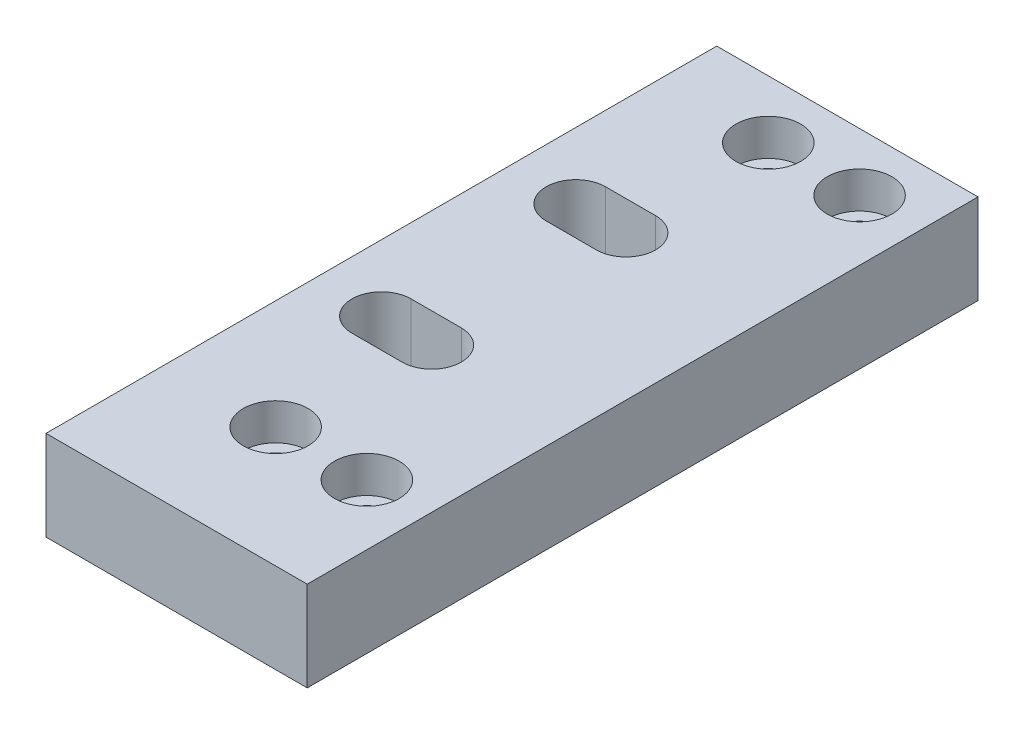
ISO-10303-21;
HEADER;
FILE_DESCRIPTION(('STEP AP214'),'2;1');
FILE_NAME('part.step','',(''),(''),'','','');
FILE_SCHEMA(('AUTOMOTIVE_DESIGN { 1 0 10303 214 1 1 1 1 }'));
ENDSEC;
DATA;
#1=APPLICATION_CONTEXT('core data for automotive mechanical design processes');
#2=APPLICATION_PROTOCOL_DEFINITION('international standard','automotive_design',2000,#1);
#3=PRODUCT_CONTEXT('',#1,'mechanical');
#4=PRODUCT('Part','Part','',(#3));
#5=PRODUCT_RELATED_PRODUCT_CATEGORY('part','',(#4));
#6=PRODUCT_DEFINITION_FORMATION('','',#4);
#7=PRODUCT_DEFINITION_CONTEXT('part definition',#1,'design');
#8=PRODUCT_DEFINITION('design','',#6,#7);
#9=PRODUCT_DEFINITION_SHAPE('','',#8);
#10=(LENGTH_UNIT() NAMED_UNIT(*) SI_UNIT(.MILLI.,.METRE.));
#11=(NAMED_UNIT(*) PLANE_ANGLE_UNIT() SI_UNIT($,.RADIAN.));
#12=(NAMED_UNIT(*) SI_UNIT($,.STERADIAN.) SOLID_ANGLE_UNIT());
#13=UNCERTAINTY_MEASURE_WITH_UNIT(LENGTH_MEASURE(1.E-05),#10,'distance_accuracy_value','');
#14=(GEOMETRIC_REPRESENTATION_CONTEXT(3) GLOBAL_UNCERTAINTY_ASSIGNED_CONTEXT((#13)) GLOBAL_UNIT_ASSIGNED_CONTEXT((#10,
#11,#12)) REPRESENTATION_CONTEXT('',''));
#15=CARTESIAN_POINT('',(0.,0.,0.));
#16=DIRECTION('',(0.,0.,1.));
#17=DIRECTION('',(1.,0.,0.));
#18=AXIS2_PLACEMENT_3D('',#15,#16,#17);
#19=CARTESIAN_POINT('',(172.730439972507,-18.55,-25.0827935222673));
#20=DIRECTION('',(0.,0.,-1.));
#21=DIRECTION('',(-1.,0.,0.));
#22=AXIS2_PLACEMENT_3D('',#19,#20,#21);
#23=PLANE('',#22);
#24=DIRECTION('',(-1.,0.,0.));
#25=VECTOR('',#24,1.);
#26=CARTESIAN_POINT('',(172.730439972507,-12.7,-25.0827935222673));
#27=LINE('',#26,#25);
#28=CARTESIAN_POINT('',(86.1333778809901,-12.7,-25.0827935222672));
#29=VERTEX_POINT('',#28);
#30=CARTESIAN_POINT('',(57.4997651451943,-12.7,-25.0827935222672));
#31=VERTEX_POINT('',#30);
#32=EDGE_CURVE('E291',#29,#31,#27,.T.);
#33=ORIENTED_EDGE('',*,*,#32,.F.);
#34=DIRECTION('',(0.,1.,0.));
#35=VECTOR('',#34,1.);
#36=CARTESIAN_POINT('',(86.1333778809901,-12.7,-25.0827935222672));
#37=LINE('',#36,#35);
#38=CARTESIAN_POINT('',(86.1333778809901,-22.55,-25.0827935222672));
#39=VERTEX_POINT('',#38);
#40=EDGE_CURVE('E278',#39,#29,#37,.T.);
#41=ORIENTED_EDGE('',*,*,#40,.F.);
#42=DIRECTION('',(1.,0.,0.));
#43=VECTOR('',#42,1.);
#44=CARTESIAN_POINT('',(57.4997651451943,-22.55,-25.0827935222672));
#45=LINE('',#44,#43);
#46=CARTESIAN_POINT('',(57.4997651451943,-22.55,-25.0827935222672));
#47=VERTEX_POINT('',#46);
#48=EDGE_CURVE('E289',#47,#39,#45,.T.);
#49=ORIENTED_EDGE('',*,*,#48,.F.);
#50=DIRECTION('',(0.,1.,0.));
#51=VECTOR('',#50,1.);
#52=CARTESIAN_POINT('',(57.4997651451943,-18.55,-25.0827935222672));
#53=LINE('',#52,#51);
#54=EDGE_CURVE('E195',#47,#31,#53,.T.);
#55=ORIENTED_EDGE('',*,*,#54,.T.);
#56=EDGE_LOOP('',(#33,#41,#49,#55));
#57=FACE_BOUND('',#56,.T.);
#58=ADVANCED_FACE('F185',(#57),#23,.T.);
#59=CARTESIAN_POINT('',(172.730439972507,-18.55,48.4420478508985));
#60=DIRECTION('',(0.,0.,-1.));
#61=DIRECTION('',(-1.,0.,0.));
#62=AXIS2_PLACEMENT_3D('',#59,#60,#61);
#63=PLANE('',#62);
#64=DIRECTION('',(0.,-1.,0.));
#65=VECTOR('',#64,1.);
#66=CARTESIAN_POINT('',(86.1333778809901,-12.7,48.4420478508985));
#67=LINE('',#66,#65);
#68=CARTESIAN_POINT('',(86.1333778809901,-12.7,48.4420478508985));
#69=VERTEX_POINT('',#68);
#70=CARTESIAN_POINT('',(86.1333778809901,-22.55,48.4420478508985));
#71=VERTEX_POINT('',#70);
#72=EDGE_CURVE('E203',#69,#71,#67,.T.);
#73=ORIENTED_EDGE('',*,*,#72,.F.);
#74=DIRECTION('',(-1.,0.,0.));
#75=VECTOR('',#74,1.);
#76=CARTESIAN_POINT('',(172.730439972507,-12.7,48.4420478508985));
#77=LINE('',#76,#75);
#78=CARTESIAN_POINT('',(57.4997651451944,-12.7,48.4420478508985));
#79=VERTEX_POINT('',#78);
#80=EDGE_CURVE('E210',#69,#79,#77,.T.);
#81=ORIENTED_EDGE('',*,*,#80,.T.);
#82=DIRECTION('',(0.,1.,0.));
#83=VECTOR('',#82,1.);
#84=CARTESIAN_POINT('',(57.4997651451944,-18.55,48.4420478508985));
#85=LINE('',#84,#83);
#86=CARTESIAN_POINT('',(57.4997651451944,-22.55,48.4420478508985));
#87=VERTEX_POINT('',#86);
#88=EDGE_CURVE('E12',#87,#79,#85,.T.);
#89=ORIENTED_EDGE('',*,*,#88,.F.);
#90=DIRECTION('',(-1.,0.,0.));
#91=VECTOR('',#90,1.);
#92=CARTESIAN_POINT('',(91.1333778809901,-22.55,48.4420478508985));
#93=LINE('',#92,#91);
#94=EDGE_CURVE('E299',#71,#87,#93,.T.);
#95=ORIENTED_EDGE('',*,*,#94,.F.);
#96=EDGE_LOOP('',(#73,#81,#89,#95));
#97=FACE_BOUND('',#96,.T.);
#98=ADVANCED_FACE('F469',(#97),#63,.F.);
#99=CARTESIAN_POINT('',(172.730439972507,-12.7,0.));
#100=DIRECTION('',(0.,1.,0.));
#101=DIRECTION('',(0.,0.,1.));
#102=AXIS2_PLACEMENT_3D('',#99,#100,#101);
#103=PLANE('',#102);
#104=CARTESIAN_POINT('',(69.4985978672434,-12.7,35.2672064777328));
#105=DIRECTION('',(0.,1.,0.));
#106=DIRECTION('',(0.,0.,1.));
#107=AXIS2_PLACEMENT_3D('',#104,#105,#106);
#108=CIRCLE('',#107,3.55);
#109=CARTESIAN_POINT('',(69.4985978672434,-12.7,38.8172064777328));
#110=VERTEX_POINT('',#109);
#111=EDGE_CURVE('E335',#110,#110,#108,.T.);
#112=ORIENTED_EDGE('',*,*,#111,.F.);
#113=EDGE_LOOP('',(#112));
#114=FACE_BOUND('',#113,.T.);
#115=CARTESIAN_POINT('',(79.4985978672434,-12.7,-18.7327935222672));
#116=DIRECTION('',(0.,1.,0.));
#117=DIRECTION('',(0.,0.,1.));
#118=AXIS2_PLACEMENT_3D('',#115,#116,#117);
#119=CIRCLE('',#118,3.55);
#120=CARTESIAN_POINT('',(79.4985978672434,-12.7,-15.1827935222672));
#121=VERTEX_POINT('',#120);
#122=EDGE_CURVE('E323',#121,#121,#119,.T.);
#123=ORIENTED_EDGE('',*,*,#122,.F.);
#124=EDGE_LOOP('',(#123));
#125=FACE_BOUND('',#124,.T.);
#126=CARTESIAN_POINT('',(69.4985978672434,-12.7,-18.7327935222672));
#127=DIRECTION('',(0.,1.,0.));
#128=DIRECTION('',(0.,0.,1.));
#129=AXIS2_PLACEMENT_3D('',#126,#127,#128);
#130=CIRCLE('',#129,3.55);
#131=CARTESIAN_POINT('',(69.4985978672434,-12.7,-15.1827935222672));
#132=VERTEX_POINT('',#131);
#133=EDGE_CURVE('E309',#132,#132,#130,.T.);
#134=ORIENTED_EDGE('',*,*,#133,.F.);
#135=EDGE_LOOP('',(#134));
#136=FACE_BOUND('',#135,.T.);
#137=CARTESIAN_POINT('',(79.4985978672434,-12.7,35.2672064777328));
#138=DIRECTION('',(0.,1.,0.));
#139=DIRECTION('',(0.,0.,1.));
#140=AXIS2_PLACEMENT_3D('',#137,#138,#139);
#141=CIRCLE('',#140,3.55);
#142=CARTESIAN_POINT('',(79.4985978672434,-12.7,38.8172064777328));
#143=VERTEX_POINT('',#142);
#144=EDGE_CURVE('E348',#143,#143,#141,.T.);
#145=ORIENTED_EDGE('',*,*,#144,.F.);
#146=EDGE_LOOP('',(#145));
#147=FACE_BOUND('',#146,.T.);
#148=DIRECTION('',(1.,0.,0.));
#149=VECTOR('',#148,1.);
#150=CARTESIAN_POINT('',(172.730439972507,-12.7,0.867206477732725));
#151=LINE('',#150,#149);
#152=CARTESIAN_POINT('',(64.7497651451943,-12.7,0.867206477732787));
#153=VERTEX_POINT('',#152);
#154=CARTESIAN_POINT('',(70.2497651451943,-12.7,0.867206477732783));
#155=VERTEX_POINT('',#154);
#156=EDGE_CURVE('E353',#153,#155,#151,.T.);
#157=ORIENTED_EDGE('',*,*,#156,.F.);
#158=CARTESIAN_POINT('',(64.7497651451943,-12.7,-2.38279352226721));
#159=DIRECTION('',(0.,1.,0.));
#160=DIRECTION('',(0.,0.,1.));
#161=AXIS2_PLACEMENT_3D('',#158,#159,#160);
#162=CIRCLE('',#161,3.25);
#163=CARTESIAN_POINT('',(64.7497651451943,-12.7,-5.63279352226722));
#164=VERTEX_POINT('',#163);
#165=EDGE_CURVE('E360',#164,#153,#162,.T.);
#166=ORIENTED_EDGE('',*,*,#165,.F.);
#167=DIRECTION('',(1.,0.,0.));
#168=VECTOR('',#167,1.);
#169=CARTESIAN_POINT('',(172.730439972507,-12.7,-5.63279352226728));
#170=LINE('',#169,#168);
#171=CARTESIAN_POINT('',(70.2497651451943,-12.7,-5.63279352226722));
#172=VERTEX_POINT('',#171);
#173=EDGE_CURVE('E363',#164,#172,#170,.T.);
#174=ORIENTED_EDGE('',*,*,#173,.T.);
#175=CARTESIAN_POINT('',(70.2497651451943,-12.7,-2.38279352226722));
#176=DIRECTION('',(0.,1.,0.));
#177=DIRECTION('',(0.,0.,1.));
#178=AXIS2_PLACEMENT_3D('',#175,#176,#177);
#179=CIRCLE('',#178,3.25);
#180=EDGE_CURVE('E366',#155,#172,#179,.T.);
#181=ORIENTED_EDGE('',*,*,#180,.F.);
#182=EDGE_LOOP('',(#157,#166,#174,#181));
#183=FACE_BOUND('',#182,.T.);
#184=DIRECTION('',(1.,0.,0.));
#185=VECTOR('',#184,1.);
#186=CARTESIAN_POINT('',(172.730439972507,-12.7,22.1672064777327));
#187=LINE('',#186,#185);
#188=CARTESIAN_POINT('',(64.7497651451943,-12.7,22.1672064777328));
#189=VERTEX_POINT('',#188);
#190=CARTESIAN_POINT('',(70.2497651451943,-12.7,22.1672064777328));
#191=VERTEX_POINT('',#190);
#192=EDGE_CURVE('E370',#189,#191,#187,.T.);
#193=ORIENTED_EDGE('',*,*,#192,.F.);
#194=CARTESIAN_POINT('',(64.7497651451943,-12.7,18.9172064777328));
#195=DIRECTION('',(0.,1.,0.));
#196=DIRECTION('',(0.,0.,1.));
#197=AXIS2_PLACEMENT_3D('',#194,#195,#196);
#198=CIRCLE('',#197,3.25);
#199=CARTESIAN_POINT('',(64.7497651451943,-12.7,15.6672064777328));
#200=VERTEX_POINT('',#199);
#201=EDGE_CURVE('E374',#200,#189,#198,.T.);
#202=ORIENTED_EDGE('',*,*,#201,.F.);
#203=DIRECTION('',(1.,0.,0.));
#204=VECTOR('',#203,1.);
#205=CARTESIAN_POINT('',(172.730439972507,-12.7,15.6672064777327));
#206=LINE('',#205,#204);
#207=CARTESIAN_POINT('',(70.2497651451943,-12.7,15.6672064777328));
#208=VERTEX_POINT('',#207);
#209=EDGE_CURVE('E377',#200,#208,#206,.T.);
#210=ORIENTED_EDGE('',*,*,#209,.T.);
#211=CARTESIAN_POINT('',(70.2497651451943,-12.7,18.9172064777328));
#212=DIRECTION('',(0.,1.,0.));
#213=DIRECTION('',(0.,0.,1.));
#214=AXIS2_PLACEMENT_3D('',#211,#212,#213);
#215=CIRCLE('',#214,3.25);
#216=EDGE_CURVE('E380',#191,#208,#215,.T.);
#217=ORIENTED_EDGE('',*,*,#216,.F.);
#218=EDGE_LOOP('',(#193,#202,#210,#217));
#219=FACE_BOUND('',#218,.T.);
#220=ORIENTED_EDGE('',*,*,#80,.F.);
#221=DIRECTION('',(0.,0.,1.));
#222=VECTOR('',#221,1.);
#223=CARTESIAN_POINT('',(86.1333778809901,-12.7,48.4420478508985));
#224=LINE('',#223,#222);
#225=EDGE_CURVE('E293',#29,#69,#224,.T.);
#226=ORIENTED_EDGE('',*,*,#225,.F.);
#227=ORIENTED_EDGE('',*,*,#32,.T.);
#228=DIRECTION('',(0.,0.,1.));
#229=VECTOR('',#228,1.);
#230=CARTESIAN_POINT('',(57.4997651451943,-12.7,0.));
#231=LINE('',#230,#229);
#232=EDGE_CURVE('E386',#31,#79,#231,.T.);
#233=ORIENTED_EDGE('',*,*,#232,.T.);
#234=EDGE_LOOP('',(#220,#226,#227,#233));
#235=FACE_BOUND('',#234,.T.);
#236=ADVANCED_FACE('F431',(#114,#125,#136,#147,#183,#219,#235),#103,.T.);
#237=CARTESIAN_POINT('',(0.,-22.55,0.));
#238=DIRECTION('',(0.,-1.,0.));
#239=DIRECTION('',(0.,0.,-1.));
#240=AXIS2_PLACEMENT_3D('',#237,#238,#239);
#241=PLANE('',#240);
#242=CARTESIAN_POINT('',(79.4985978672434,-22.55,35.2672064777328));
#243=DIRECTION('',(0.,-1.,0.));
#244=DIRECTION('',(0.,0.,-1.));
#245=AXIS2_PLACEMENT_3D('',#242,#243,#244);
#246=CIRCLE('',#245,2.2);
#247=CARTESIAN_POINT('',(79.4985978672434,-22.55,33.0672064777328));
#248=VERTEX_POINT('',#247);
#249=EDGE_CURVE('E801',#248,#248,#246,.T.);
#250=ORIENTED_EDGE('',*,*,#249,.F.);
#251=EDGE_LOOP('',(#250));
#252=FACE_BOUND('',#251,.T.);
#253=CARTESIAN_POINT('',(79.4985978672434,-22.55,-18.7327935222672));
#254=DIRECTION('',(0.,-1.,0.));
#255=DIRECTION('',(0.,0.,-1.));
#256=AXIS2_PLACEMENT_3D('',#253,#254,#255);
#257=CIRCLE('',#256,2.2);
#258=CARTESIAN_POINT('',(79.4985978672434,-22.55,-20.9327935222672));
#259=VERTEX_POINT('',#258);
#260=EDGE_CURVE('E442',#259,#259,#257,.T.);
#261=ORIENTED_EDGE('',*,*,#260,.F.);
#262=EDGE_LOOP('',(#261));
#263=FACE_BOUND('',#262,.T.);
#264=DIRECTION('',(-1.,0.,0.));
#265=VECTOR('',#264,1.);
#266=CARTESIAN_POINT('',(64.7497651451943,-22.55,0.867206477732787));
#267=LINE('',#266,#265);
#268=CARTESIAN_POINT('',(70.2497651451943,-22.55,0.867206477732783));
#269=VERTEX_POINT('',#268);
#270=CARTESIAN_POINT('',(64.7497651451943,-22.55,0.867206477732788));
#271=VERTEX_POINT('',#270);
#272=EDGE_CURVE('E428',#269,#271,#267,.T.);
#273=ORIENTED_EDGE('',*,*,#272,.F.);
#274=CARTESIAN_POINT('',(70.2497651451943,-22.55,-2.38279352226722));
#275=DIRECTION('',(0.,-1.,0.));
#276=DIRECTION('',(0.,0.,-1.));
#277=AXIS2_PLACEMENT_3D('',#274,#275,#276);
#278=CIRCLE('',#277,3.25);
#279=CARTESIAN_POINT('',(70.2497651451943,-22.55,-5.63279352226722));
#280=VERTEX_POINT('',#279);
#281=EDGE_CURVE('E437',#280,#269,#278,.T.);
#282=ORIENTED_EDGE('',*,*,#281,.F.);
#283=DIRECTION('',(1.,0.,0.));
#284=VECTOR('',#283,1.);
#285=CARTESIAN_POINT('',(64.7497651451943,-22.55,-5.63279352226722));
#286=LINE('',#285,#284);
#287=CARTESIAN_POINT('',(64.7497651451943,-22.55,-5.63279352226722));
#288=VERTEX_POINT('',#287);
#289=EDGE_CURVE('E305',#288,#280,#286,.T.);
#290=ORIENTED_EDGE('',*,*,#289,.F.);
#291=CARTESIAN_POINT('',(64.7497651451943,-22.55,-2.38279352226721));
#292=DIRECTION('',(0.,-1.,0.));
#293=DIRECTION('',(0.,0.,-1.));
#294=AXIS2_PLACEMENT_3D('',#291,#292,#293);
#295=CIRCLE('',#294,3.25);
#296=EDGE_CURVE('E445',#271,#288,#295,.T.);
#297=ORIENTED_EDGE('',*,*,#296,.F.);
#298=EDGE_LOOP('',(#273,#282,#290,#297));
#299=FACE_BOUND('',#298,.T.);
#300=CARTESIAN_POINT('',(69.4985978672434,-22.55,-18.7327935222672));
#301=DIRECTION('',(0.,-1.,0.));
#302=DIRECTION('',(0.,0.,-1.));
#303=AXIS2_PLACEMENT_3D('',#300,#301,#302);
#304=CIRCLE('',#303,2.2);
#305=CARTESIAN_POINT('',(69.4985978672434,-22.55,-20.9327935222672));
#306=VERTEX_POINT('',#305);
#307=EDGE_CURVE('E803',#306,#306,#304,.T.);
#308=ORIENTED_EDGE('',*,*,#307,.F.);
#309=EDGE_LOOP('',(#308));
#310=FACE_BOUND('',#309,.T.);
#311=CARTESIAN_POINT('',(69.4985978672434,-22.55,35.2672064777328));
#312=DIRECTION('',(0.,-1.,0.));
#313=DIRECTION('',(0.,0.,-1.));
#314=AXIS2_PLACEMENT_3D('',#311,#312,#313);
#315=CIRCLE('',#314,2.2);
#316=CARTESIAN_POINT('',(69.4985978672434,-22.55,33.0672064777328));
#317=VERTEX_POINT('',#316);
#318=EDGE_CURVE('E804',#317,#317,#315,.T.);
#319=ORIENTED_EDGE('',*,*,#318,.F.);
#320=EDGE_LOOP('',(#319));
#321=FACE_BOUND('',#320,.T.);
#322=DIRECTION('',(1.,0.,0.));
#323=VECTOR('',#322,1.);
#324=CARTESIAN_POINT('',(64.7497651451943,-22.55,15.6672064777328));
#325=LINE('',#324,#323);
#326=CARTESIAN_POINT('',(64.7497651451943,-22.55,15.6672064777328));
#327=VERTEX_POINT('',#326);
#328=CARTESIAN_POINT('',(70.2497651451943,-22.55,15.6672064777328));
#329=VERTEX_POINT('',#328);
#330=EDGE_CURVE('E826',#327,#329,#325,.T.);
#331=ORIENTED_EDGE('',*,*,#330,.F.);
#332=CARTESIAN_POINT('',(64.7497651451943,-22.55,18.9172064777328));
#333=DIRECTION('',(0.,-1.,0.));
#334=DIRECTION('',(0.,0.,-1.));
#335=AXIS2_PLACEMENT_3D('',#332,#333,#334);
#336=CIRCLE('',#335,3.25);
#337=CARTESIAN_POINT('',(64.7497651451943,-22.55,22.1672064777328));
#338=VERTEX_POINT('',#337);
#339=EDGE_CURVE('E830',#338,#327,#336,.T.);
#340=ORIENTED_EDGE('',*,*,#339,.F.);
#341=DIRECTION('',(-1.,0.,0.));
#342=VECTOR('',#341,1.);
#343=CARTESIAN_POINT('',(64.7497651451943,-22.55,22.1672064777328));
#344=LINE('',#343,#342);
#345=CARTESIAN_POINT('',(70.2497651451943,-22.55,22.1672064777328));
#346=VERTEX_POINT('',#345);
#347=EDGE_CURVE('E811',#346,#338,#344,.T.);
#348=ORIENTED_EDGE('',*,*,#347,.F.);
#349=CARTESIAN_POINT('',(70.2497651451943,-22.55,18.9172064777328));
#350=DIRECTION('',(0.,-1.,0.));
#351=DIRECTION('',(0.,0.,-1.));
#352=AXIS2_PLACEMENT_3D('',#349,#350,#351);
#353=CIRCLE('',#352,3.25);
#354=EDGE_CURVE('E822',#329,#346,#353,.T.);
#355=ORIENTED_EDGE('',*,*,#354,.F.);
#356=EDGE_LOOP('',(#331,#340,#348,#355));
#357=FACE_BOUND('',#356,.T.);
#358=ORIENTED_EDGE('',*,*,#48,.T.);
#359=DIRECTION('',(0.,0.,-1.));
#360=VECTOR('',#359,1.);
#361=CARTESIAN_POINT('',(86.1333778809901,-22.55,48.4420478508985));
#362=LINE('',#361,#360);
#363=EDGE_CURVE('E275',#71,#39,#362,.T.);
#364=ORIENTED_EDGE('',*,*,#363,.F.);
#365=ORIENTED_EDGE('',*,*,#94,.T.);
#366=DIRECTION('',(0.,0.,-1.));
#367=VECTOR('',#366,1.);
#368=CARTESIAN_POINT('',(57.4997651451944,-22.55,48.4420478508985));
#369=LINE('',#368,#367);
#370=EDGE_CURVE('E297',#87,#47,#369,.T.);
#371=ORIENTED_EDGE('',*,*,#370,.T.);
#372=EDGE_LOOP('',(#358,#364,#365,#371));
#373=FACE_BOUND('',#372,.T.);
#374=ADVANCED_FACE('F295',(#252,#263,#299,#310,#321,#357,#373),#241,.T.);
#375=CARTESIAN_POINT('',(69.4985978672434,-18.55,-18.7327935222672));
#376=DIRECTION('',(0.,1.,0.));
#377=DIRECTION('',(0.,0.,1.));
#378=AXIS2_PLACEMENT_3D('',#375,#376,#377);
#379=CYLINDRICAL_SURFACE('',#378,2.19999999999999);
#380=CARTESIAN_POINT('',(69.4985978672434,-16.7,-18.7327935222672));
#381=DIRECTION('',(0.,1.,0.));
#382=DIRECTION('',(0.,0.,1.));
#383=AXIS2_PLACEMENT_3D('',#380,#381,#382);
#384=CIRCLE('',#383,2.2);
#385=CARTESIAN_POINT('',(69.4985978672434,-16.7,-16.5327935222672));
#386=VERTEX_POINT('',#385);
#387=EDGE_CURVE('E313',#386,#386,#384,.T.);
#388=ORIENTED_EDGE('',*,*,#387,.T.);
#389=EDGE_LOOP('',(#388));
#390=FACE_BOUND('',#389,.T.);
#391=ORIENTED_EDGE('',*,*,#307,.T.);
#392=EDGE_LOOP('',(#391));
#393=FACE_BOUND('',#392,.T.);
#394=ADVANCED_FACE('F476',(#390,#393),#379,.F.);
#395=CARTESIAN_POINT('',(79.4985978672434,-18.55,-18.7327935222672));
#396=DIRECTION('',(0.,1.,0.));
#397=DIRECTION('',(0.,0.,1.));
#398=AXIS2_PLACEMENT_3D('',#395,#396,#397);
#399=CYLINDRICAL_SURFACE('',#398,2.19999999999999);
#400=CARTESIAN_POINT('',(79.4985978672434,-16.7,-18.7327935222672));
#401=DIRECTION('',(0.,1.,0.));
#402=DIRECTION('',(0.,0.,1.));
#403=AXIS2_PLACEMENT_3D('',#400,#401,#402);
#404=CIRCLE('',#403,2.2);
#405=CARTESIAN_POINT('',(79.4985978672434,-16.7,-16.5327935222672));
#406=VERTEX_POINT('',#405);
#407=EDGE_CURVE('E318',#406,#406,#404,.T.);
#408=ORIENTED_EDGE('',*,*,#407,.T.);
#409=EDGE_LOOP('',(#408));
#410=FACE_BOUND('',#409,.T.);
#411=ORIENTED_EDGE('',*,*,#260,.T.);
#412=EDGE_LOOP('',(#411));
#413=FACE_BOUND('',#412,.T.);
#414=ADVANCED_FACE('F479',(#410,#413),#399,.F.);
#415=CARTESIAN_POINT('',(79.4985978672434,-18.55,35.2672064777328));
#416=DIRECTION('',(0.,1.,0.));
#417=DIRECTION('',(0.,0.,1.));
#418=AXIS2_PLACEMENT_3D('',#415,#416,#417);
#419=CYLINDRICAL_SURFACE('',#418,2.19999999999999);
#420=CARTESIAN_POINT('',(79.4985978672434,-16.7,35.2672064777328));
#421=DIRECTION('',(0.,1.,0.));
#422=DIRECTION('',(0.,0.,1.));
#423=AXIS2_PLACEMENT_3D('',#420,#421,#422);
#424=CIRCLE('',#423,2.2);
#425=CARTESIAN_POINT('',(79.4985978672434,-16.7,37.4672064777328));
#426=VERTEX_POINT('',#425);
#427=EDGE_CURVE('E322',#426,#426,#424,.T.);
#428=ORIENTED_EDGE('',*,*,#427,.T.);
#429=EDGE_LOOP('',(#428));
#430=FACE_BOUND('',#429,.T.);
#431=ORIENTED_EDGE('',*,*,#249,.T.);
#432=EDGE_LOOP('',(#431));
#433=FACE_BOUND('',#432,.T.);
#434=ADVANCED_FACE('F483',(#430,#433),#419,.F.);
#435=CARTESIAN_POINT('',(69.4985978672434,-18.55,35.2672064777328));
#436=DIRECTION('',(0.,1.,0.));
#437=DIRECTION('',(0.,0.,1.));
#438=AXIS2_PLACEMENT_3D('',#435,#436,#437);
#439=CYLINDRICAL_SURFACE('',#438,2.19999999999999);
#440=CARTESIAN_POINT('',(69.4985978672434,-16.7,35.2672064777328));
#441=DIRECTION('',(0.,1.,0.));
#442=DIRECTION('',(0.,0.,1.));
#443=AXIS2_PLACEMENT_3D('',#440,#441,#442);
#444=CIRCLE('',#443,2.2);
#445=CARTESIAN_POINT('',(69.4985978672434,-16.7,37.4672064777328));
#446=VERTEX_POINT('',#445);
#447=EDGE_CURVE('E331',#446,#446,#444,.T.);
#448=ORIENTED_EDGE('',*,*,#447,.T.);
#449=EDGE_LOOP('',(#448));
#450=FACE_BOUND('',#449,.T.);
#451=ORIENTED_EDGE('',*,*,#318,.T.);
#452=EDGE_LOOP('',(#451));
#453=FACE_BOUND('',#452,.T.);
#454=ADVANCED_FACE('F487',(#450,#453),#439,.F.);
#455=CARTESIAN_POINT('',(172.730439972507,-18.55,22.1672064777327));
#456=DIRECTION('',(0.,0.,1.));
#457=DIRECTION('',(1.,0.,0.));
#458=AXIS2_PLACEMENT_3D('',#455,#456,#457);
#459=PLANE('',#458);
#460=ORIENTED_EDGE('',*,*,#192,.T.);
#461=DIRECTION('',(0.,1.,0.));
#462=VECTOR('',#461,1.);
#463=CARTESIAN_POINT('',(70.2497651451943,-18.55,22.1672064777328));
#464=LINE('',#463,#462);
#465=EDGE_CURVE('E393',#346,#191,#464,.T.);
#466=ORIENTED_EDGE('',*,*,#465,.F.);
#467=ORIENTED_EDGE('',*,*,#347,.T.);
#468=DIRECTION('',(0.,1.,0.));
#469=VECTOR('',#468,1.);
#470=CARTESIAN_POINT('',(64.7497651451943,-18.55,22.1672064777328));
#471=LINE('',#470,#469);
#472=EDGE_CURVE('E405',#338,#189,#471,.T.);
#473=ORIENTED_EDGE('',*,*,#472,.T.);
#474=EDGE_LOOP('',(#460,#466,#467,#473));
#475=FACE_BOUND('',#474,.T.);
#476=ADVANCED_FACE('F491',(#475),#459,.F.);
#477=CARTESIAN_POINT('',(70.2497651451943,-18.55,18.9172064777328));
#478=DIRECTION('',(0.,1.,0.));
#479=DIRECTION('',(0.,0.,1.));
#480=AXIS2_PLACEMENT_3D('',#477,#478,#479);
#481=CYLINDRICAL_SURFACE('',#480,3.25);
#482=ORIENTED_EDGE('',*,*,#216,.T.);
#483=DIRECTION('',(0.,1.,0.));
#484=VECTOR('',#483,1.);
#485=CARTESIAN_POINT('',(70.2497651451943,-18.55,15.6672064777328));
#486=LINE('',#485,#484);
#487=EDGE_CURVE('E397',#329,#208,#486,.T.);
#488=ORIENTED_EDGE('',*,*,#487,.F.);
#489=ORIENTED_EDGE('',*,*,#354,.T.);
#490=ORIENTED_EDGE('',*,*,#465,.T.);
#491=EDGE_LOOP('',(#482,#488,#489,#490));
#492=FACE_BOUND('',#491,.T.);
#493=ADVANCED_FACE('F493',(#492),#481,.F.);
#494=CARTESIAN_POINT('',(172.730439972507,-18.55,15.6672064777327));
#495=DIRECTION('',(0.,0.,1.));
#496=DIRECTION('',(1.,0.,0.));
#497=AXIS2_PLACEMENT_3D('',#494,#495,#496);
#498=PLANE('',#497);
#499=ORIENTED_EDGE('',*,*,#209,.F.);
#500=DIRECTION('',(0.,1.,0.));
#501=VECTOR('',#500,1.);
#502=CARTESIAN_POINT('',(64.7497651451943,-18.55,15.6672064777328));
#503=LINE('',#502,#501);
#504=EDGE_CURVE('E401',#327,#200,#503,.T.);
#505=ORIENTED_EDGE('',*,*,#504,.F.);
#506=ORIENTED_EDGE('',*,*,#330,.T.);
#507=ORIENTED_EDGE('',*,*,#487,.T.);
#508=EDGE_LOOP('',(#499,#505,#506,#507));
#509=FACE_BOUND('',#508,.T.);
#510=ADVANCED_FACE('F496',(#509),#498,.T.);
#511=CARTESIAN_POINT('',(172.730439972507,-18.55,0.867206477732725));
#512=DIRECTION('',(0.,0.,1.));
#513=DIRECTION('',(1.,0.,0.));
#514=AXIS2_PLACEMENT_3D('',#511,#512,#513);
#515=PLANE('',#514);
#516=ORIENTED_EDGE('',*,*,#156,.T.);
#517=DIRECTION('',(0.,1.,0.));
#518=VECTOR('',#517,1.);
#519=CARTESIAN_POINT('',(70.2497651451943,-18.55,0.867206477732783));
#520=LINE('',#519,#518);
#521=EDGE_CURVE('E409',#269,#155,#520,.T.);
#522=ORIENTED_EDGE('',*,*,#521,.F.);
#523=ORIENTED_EDGE('',*,*,#272,.T.);
#524=DIRECTION('',(0.,1.,0.));
#525=VECTOR('',#524,1.);
#526=CARTESIAN_POINT('',(64.7497651451943,-18.55,0.867206477732787));
#527=LINE('',#526,#525);
#528=EDGE_CURVE('E189',#271,#153,#527,.T.);
#529=ORIENTED_EDGE('',*,*,#528,.T.);
#530=EDGE_LOOP('',(#516,#522,#523,#529));
#531=FACE_BOUND('',#530,.T.);
#532=ADVANCED_FACE('F187',(#531),#515,.F.);
#533=CARTESIAN_POINT('',(70.2497651451943,-18.55,-2.38279352226722));
#534=DIRECTION('',(0.,1.,0.));
#535=DIRECTION('',(0.,0.,1.));
#536=AXIS2_PLACEMENT_3D('',#533,#534,#535);
#537=CYLINDRICAL_SURFACE('',#536,3.25);
#538=ORIENTED_EDGE('',*,*,#180,.T.);
#539=DIRECTION('',(0.,1.,0.));
#540=VECTOR('',#539,1.);
#541=CARTESIAN_POINT('',(70.2497651451943,-18.55,-5.63279352226722));
#542=LINE('',#541,#540);
#543=EDGE_CURVE('E413',#280,#172,#542,.T.);
#544=ORIENTED_EDGE('',*,*,#543,.F.);
#545=ORIENTED_EDGE('',*,*,#281,.T.);
#546=ORIENTED_EDGE('',*,*,#521,.T.);
#547=EDGE_LOOP('',(#538,#544,#545,#546));
#548=FACE_BOUND('',#547,.T.);
#549=ADVANCED_FACE('F435',(#548),#537,.F.);
#550=CARTESIAN_POINT('',(172.730439972507,-18.55,-5.63279352226728));
#551=DIRECTION('',(0.,0.,1.));
#552=DIRECTION('',(1.,0.,0.));
#553=AXIS2_PLACEMENT_3D('',#550,#551,#552);
#554=PLANE('',#553);
#555=ORIENTED_EDGE('',*,*,#173,.F.);
#556=DIRECTION('',(0.,1.,0.));
#557=VECTOR('',#556,1.);
#558=CARTESIAN_POINT('',(64.7497651451943,-18.55,-5.63279352226722));
#559=LINE('',#558,#557);
#560=EDGE_CURVE('E416',#288,#164,#559,.T.);
#561=ORIENTED_EDGE('',*,*,#560,.F.);
#562=ORIENTED_EDGE('',*,*,#289,.T.);
#563=ORIENTED_EDGE('',*,*,#543,.T.);
#564=EDGE_LOOP('',(#555,#561,#562,#563));
#565=FACE_BOUND('',#564,.T.);
#566=ADVANCED_FACE('F453',(#565),#554,.T.);
#567=CARTESIAN_POINT('',(64.7497651451943,-18.55,18.9172064777328));
#568=DIRECTION('',(0.,1.,0.));
#569=DIRECTION('',(0.,0.,1.));
#570=AXIS2_PLACEMENT_3D('',#567,#568,#569);
#571=CYLINDRICAL_SURFACE('',#570,3.25);
#572=ORIENTED_EDGE('',*,*,#201,.T.);
#573=ORIENTED_EDGE('',*,*,#472,.F.);
#574=ORIENTED_EDGE('',*,*,#339,.T.);
#575=ORIENTED_EDGE('',*,*,#504,.T.);
#576=EDGE_LOOP('',(#572,#573,#574,#575));
#577=FACE_BOUND('',#576,.T.);
#578=ADVANCED_FACE('F457',(#577),#571,.F.);
#579=CARTESIAN_POINT('',(64.7497651451943,-18.55,-2.38279352226721));
#580=DIRECTION('',(0.,1.,0.));
#581=DIRECTION('',(0.,0.,1.));
#582=AXIS2_PLACEMENT_3D('',#579,#580,#581);
#583=CYLINDRICAL_SURFACE('',#582,3.25);
#584=ORIENTED_EDGE('',*,*,#165,.T.);
#585=ORIENTED_EDGE('',*,*,#528,.F.);
#586=ORIENTED_EDGE('',*,*,#296,.T.);
#587=ORIENTED_EDGE('',*,*,#560,.T.);
#588=EDGE_LOOP('',(#584,#585,#586,#587));
#589=FACE_BOUND('',#588,.T.);
#590=ADVANCED_FACE('F454',(#589),#583,.F.);
#591=CARTESIAN_POINT('',(57.4997651451943,-18.55,0.));
#592=DIRECTION('',(-1.,0.,0.));
#593=DIRECTION('',(0.,0.,1.));
#594=AXIS2_PLACEMENT_3D('',#591,#592,#593);
#595=PLANE('',#594);
#596=ORIENTED_EDGE('',*,*,#232,.F.);
#597=ORIENTED_EDGE('',*,*,#54,.F.);
#598=ORIENTED_EDGE('',*,*,#370,.F.);
#599=ORIENTED_EDGE('',*,*,#88,.T.);
#600=EDGE_LOOP('',(#596,#597,#598,#599));
#601=FACE_BOUND('',#600,.T.);
#602=ADVANCED_FACE('F456',(#601),#595,.T.);
#603=CARTESIAN_POINT('',(79.4985978672434,-16.7,35.2672064777328));
#604=DIRECTION('',(0.,1.,0.));
#605=DIRECTION('',(0.,0.,1.));
#606=AXIS2_PLACEMENT_3D('',#603,#604,#605);
#607=CYLINDRICAL_SURFACE('',#606,3.55);
#608=CARTESIAN_POINT('',(79.4985978672434,-16.7,35.2672064777328));
#609=DIRECTION('',(0.,1.,0.));
#610=DIRECTION('',(0.,0.,1.));
#611=AXIS2_PLACEMENT_3D('',#608,#609,#610);
#612=CIRCLE('',#611,3.55);
#613=CARTESIAN_POINT('',(79.4985978672434,-16.7,38.8172064777328));
#614=VERTEX_POINT('',#613);
#615=EDGE_CURVE('E349',#614,#614,#612,.T.);
#616=ORIENTED_EDGE('',*,*,#615,.F.);
#617=EDGE_LOOP('',(#616));
#618=FACE_BOUND('',#617,.T.);
#619=ORIENTED_EDGE('',*,*,#144,.T.);
#620=EDGE_LOOP('',(#619));
#621=FACE_BOUND('',#620,.T.);
#622=ADVANCED_FACE('F462',(#618,#621),#607,.F.);
#623=CARTESIAN_POINT('',(79.4985978672434,-16.7,35.2672064777328));
#624=DIRECTION('',(0.,1.,0.));
#625=DIRECTION('',(0.,0.,1.));
#626=AXIS2_PLACEMENT_3D('',#623,#624,#625);
#627=PLANE('',#626);
#628=ORIENTED_EDGE('',*,*,#427,.F.);
#629=EDGE_LOOP('',(#628));
#630=FACE_BOUND('',#629,.T.);
#631=ORIENTED_EDGE('',*,*,#615,.T.);
#632=EDGE_LOOP('',(#631));
#633=FACE_BOUND('',#632,.T.);
#634=ADVANCED_FACE('F617',(#630,#633),#627,.T.);
#635=CARTESIAN_POINT('',(69.4985978672434,-16.7,-18.7327935222672));
#636=DIRECTION('',(0.,1.,0.));
#637=DIRECTION('',(0.,0.,1.));
#638=AXIS2_PLACEMENT_3D('',#635,#636,#637);
#639=CYLINDRICAL_SURFACE('',#638,3.55);
#640=CARTESIAN_POINT('',(69.4985978672434,-16.7,-18.7327935222672));
#641=DIRECTION('',(0.,1.,0.));
#642=DIRECTION('',(0.,0.,1.));
#643=AXIS2_PLACEMENT_3D('',#640,#641,#642);
#644=CIRCLE('',#643,3.55);
#645=CARTESIAN_POINT('',(69.4985978672434,-16.7,-15.1827935222672));
#646=VERTEX_POINT('',#645);
#647=EDGE_CURVE('E314',#646,#646,#644,.T.);
#648=ORIENTED_EDGE('',*,*,#647,.F.);
#649=EDGE_LOOP('',(#648));
#650=FACE_BOUND('',#649,.T.);
#651=ORIENTED_EDGE('',*,*,#133,.T.);
#652=EDGE_LOOP('',(#651));
#653=FACE_BOUND('',#652,.T.);
#654=ADVANCED_FACE('F609',(#650,#653),#639,.F.);
#655=CARTESIAN_POINT('',(69.4985978672434,-16.7,-18.7327935222672));
#656=DIRECTION('',(0.,1.,0.));
#657=DIRECTION('',(0.,0.,1.));
#658=AXIS2_PLACEMENT_3D('',#655,#656,#657);
#659=PLANE('',#658);
#660=ORIENTED_EDGE('',*,*,#387,.F.);
#661=EDGE_LOOP('',(#660));
#662=FACE_BOUND('',#661,.T.);
#663=ORIENTED_EDGE('',*,*,#647,.T.);
#664=EDGE_LOOP('',(#663));
#665=FACE_BOUND('',#664,.T.);
#666=ADVANCED_FACE('F601',(#662,#665),#659,.T.);
#667=CARTESIAN_POINT('',(79.4985978672434,-16.7,-18.7327935222672));
#668=DIRECTION('',(0.,1.,0.));
#669=DIRECTION('',(0.,0.,1.));
#670=AXIS2_PLACEMENT_3D('',#667,#668,#669);
#671=CYLINDRICAL_SURFACE('',#670,3.55);
#672=CARTESIAN_POINT('',(79.4985978672434,-16.7,-18.7327935222672));
#673=DIRECTION('',(0.,1.,0.));
#674=DIRECTION('',(0.,0.,1.));
#675=AXIS2_PLACEMENT_3D('',#672,#673,#674);
#676=CIRCLE('',#675,3.55);
#677=CARTESIAN_POINT('',(79.4985978672434,-16.7,-15.1827935222672));
#678=VERTEX_POINT('',#677);
#679=EDGE_CURVE('E327',#678,#678,#676,.T.);
#680=ORIENTED_EDGE('',*,*,#679,.F.);
#681=EDGE_LOOP('',(#680));
#682=FACE_BOUND('',#681,.T.);
#683=ORIENTED_EDGE('',*,*,#122,.T.);
#684=EDGE_LOOP('',(#683));
#685=FACE_BOUND('',#684,.T.);
#686=ADVANCED_FACE('F593',(#682,#685),#671,.F.);
#687=CARTESIAN_POINT('',(79.4985978672434,-16.7,-18.7327935222672));
#688=DIRECTION('',(0.,1.,0.));
#689=DIRECTION('',(0.,0.,1.));
#690=AXIS2_PLACEMENT_3D('',#687,#688,#689);
#691=PLANE('',#690);
#692=ORIENTED_EDGE('',*,*,#407,.F.);
#693=EDGE_LOOP('',(#692));
#694=FACE_BOUND('',#693,.T.);
#695=ORIENTED_EDGE('',*,*,#679,.T.);
#696=EDGE_LOOP('',(#695));
#697=FACE_BOUND('',#696,.T.);
#698=ADVANCED_FACE('F585',(#694,#697),#691,.T.);
#699=CARTESIAN_POINT('',(69.4985978672434,-16.7,35.2672064777328));
#700=DIRECTION('',(0.,1.,0.));
#701=DIRECTION('',(0.,0.,1.));
#702=AXIS2_PLACEMENT_3D('',#699,#700,#701);
#703=CYLINDRICAL_SURFACE('',#702,3.55);
#704=CARTESIAN_POINT('',(69.4985978672434,-16.7,35.2672064777328));
#705=DIRECTION('',(0.,1.,0.));
#706=DIRECTION('',(0.,0.,1.));
#707=AXIS2_PLACEMENT_3D('',#704,#705,#706);
#708=CIRCLE('',#707,3.55);
#709=CARTESIAN_POINT('',(69.4985978672434,-16.7,38.8172064777328));
#710=VERTEX_POINT('',#709);
#711=EDGE_CURVE('E303',#710,#710,#708,.T.);
#712=ORIENTED_EDGE('',*,*,#711,.F.);
#713=EDGE_LOOP('',(#712));
#714=FACE_BOUND('',#713,.T.);
#715=ORIENTED_EDGE('',*,*,#111,.T.);
#716=EDGE_LOOP('',(#715));
#717=FACE_BOUND('',#716,.T.);
#718=ADVANCED_FACE('F576',(#714,#717),#703,.F.);
#719=CARTESIAN_POINT('',(69.4985978672434,-16.7,35.2672064777328));
#720=DIRECTION('',(0.,1.,0.));
#721=DIRECTION('',(0.,0.,1.));
#722=AXIS2_PLACEMENT_3D('',#719,#720,#721);
#723=PLANE('',#722);
#724=ORIENTED_EDGE('',*,*,#447,.F.);
#725=EDGE_LOOP('',(#724));
#726=FACE_BOUND('',#725,.T.);
#727=ORIENTED_EDGE('',*,*,#711,.T.);
#728=EDGE_LOOP('',(#727));
#729=FACE_BOUND('',#728,.T.);
#730=ADVANCED_FACE('F567',(#726,#729),#723,.T.);
#731=CARTESIAN_POINT('',(86.1333778809901,0.,0.));
#732=DIRECTION('',(1.,0.,0.));
#733=DIRECTION('',(0.,0.,-1.));
#734=AXIS2_PLACEMENT_3D('',#731,#732,#733);
#735=PLANE('',#734);
#736=ORIENTED_EDGE('',*,*,#72,.T.);
#737=ORIENTED_EDGE('',*,*,#363,.T.);
#738=ORIENTED_EDGE('',*,*,#40,.T.);
#739=ORIENTED_EDGE('',*,*,#225,.T.);
#740=EDGE_LOOP('',(#736,#737,#738,#739));
#741=FACE_BOUND('',#740,.T.);
#742=ADVANCED_FACE('F277',(#741),#735,.T.);
#743=CLOSED_SHELL('',(#58,#98,#236,#374,#394,#414,#434,#454,#476,#493,#510,#532,#549,#566,#578,
#590,#602,#622,#634,#654,#666,#686,#698,#718,#730,#742));
#744=MANIFOLD_SOLID_BREP('B2',#743);
#745=ADVANCED_BREP_SHAPE_REPRESENTATION('',(#18,#744),#14);
#746=SHAPE_DEFINITION_REPRESENTATION(#9,#745);
ENDSEC;
END-ISO-10303-21;
